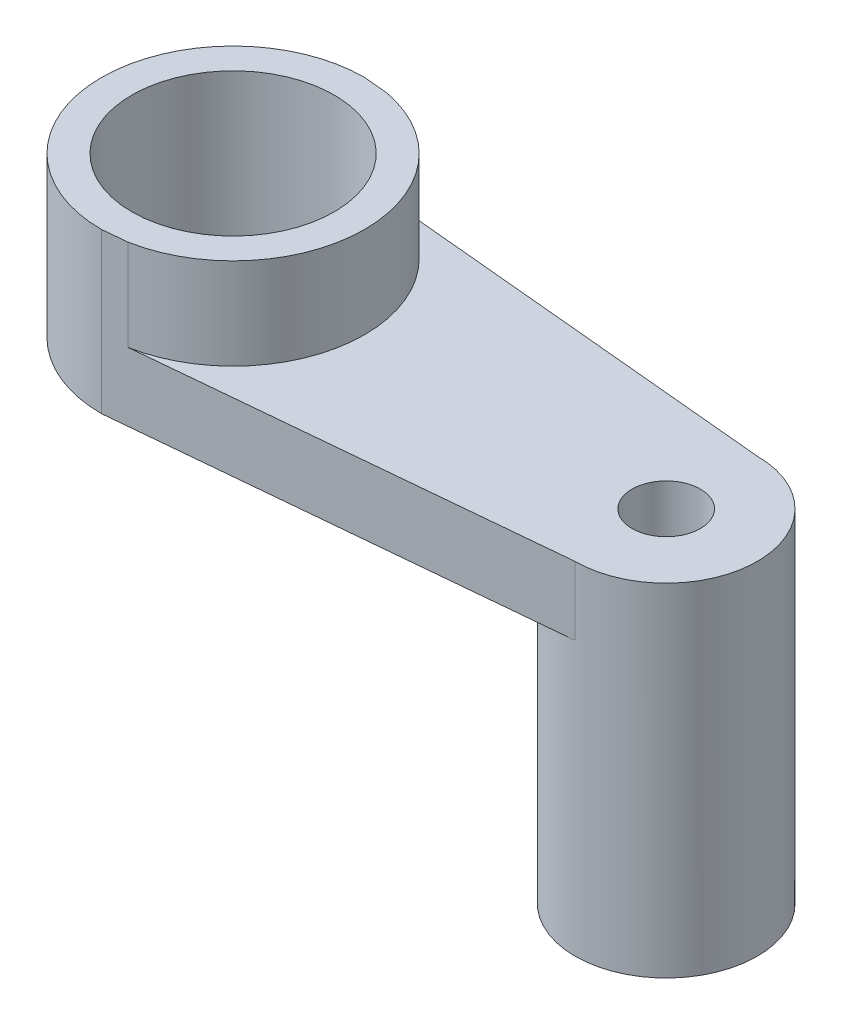
ISO-10303-21;
HEADER;
FILE_DESCRIPTION(('STEP AP214'),'2;1');
FILE_NAME('part.step','',(''),(''),'','','');
FILE_SCHEMA(('AUTOMOTIVE_DESIGN { 1 0 10303 214 1 1 1 1 }'));
ENDSEC;
DATA;
#1=APPLICATION_CONTEXT('core data for automotive mechanical design processes');
#2=APPLICATION_PROTOCOL_DEFINITION('international standard','automotive_design',2000,#1);
#3=PRODUCT_CONTEXT('',#1,'mechanical');
#4=PRODUCT('Part','Part','',(#3));
#5=PRODUCT_RELATED_PRODUCT_CATEGORY('part','',(#4));
#6=PRODUCT_DEFINITION_FORMATION('','',#4);
#7=PRODUCT_DEFINITION_CONTEXT('part definition',#1,'design');
#8=PRODUCT_DEFINITION('design','',#6,#7);
#9=PRODUCT_DEFINITION_SHAPE('','',#8);
#10=(LENGTH_UNIT() NAMED_UNIT(*) SI_UNIT(.MILLI.,.METRE.));
#11=(NAMED_UNIT(*) PLANE_ANGLE_UNIT() SI_UNIT($,.RADIAN.));
#12=(NAMED_UNIT(*) SI_UNIT($,.STERADIAN.) SOLID_ANGLE_UNIT());
#13=UNCERTAINTY_MEASURE_WITH_UNIT(LENGTH_MEASURE(1.E-05),#10,'distance_accuracy_value','');
#14=(GEOMETRIC_REPRESENTATION_CONTEXT(3) GLOBAL_UNCERTAINTY_ASSIGNED_CONTEXT((#13)) GLOBAL_UNIT_ASSIGNED_CONTEXT((#10,
#11,#12)) REPRESENTATION_CONTEXT('',''));
#15=CARTESIAN_POINT('',(0.,0.,0.));
#16=DIRECTION('',(0.,0.,1.));
#17=DIRECTION('',(1.,0.,0.));
#18=AXIS2_PLACEMENT_3D('',#15,#16,#17);
#19=CARTESIAN_POINT('',(-0.0537551480765791,14.,-0.575036498164508));
#20=DIRECTION('',(-0.0930754832480089,0.,-0.995659055308668));
#21=DIRECTION('',(-0.995659055308668,0.,0.0930754832480089));
#22=AXIS2_PLACEMENT_3D('',#19,#20,#21);
#23=PLANE('',#22);
#24=DIRECTION('',(0.995659055308668,0.,-0.0930754832480089));
#25=VECTOR('',#24,1.);
#26=CARTESIAN_POINT('',(-0.0537551480765791,0.,-0.575036498164508));
#27=LINE('',#26,#25);
#28=CARTESIAN_POINT('',(-38.9529825577755,0.,3.06131308337924));
#29=VERTEX_POINT('',#28);
#30=CARTESIAN_POINT('',(-0.952982557775477,0.,-0.490975568611034));
#31=VERTEX_POINT('',#30);
#32=EDGE_CURVE('E119',#29,#31,#27,.T.);
#33=ORIENTED_EDGE('',*,*,#32,.T.);
#34=DIRECTION('',(0.,-1.,0.));
#35=VECTOR('',#34,1.);
#36=CARTESIAN_POINT('',(-0.952982557775477,6.,-0.490975568611034));
#37=LINE('',#36,#35);
#38=CARTESIAN_POINT('',(-0.952982557775477,6.,-0.490975568611034));
#39=VERTEX_POINT('',#38);
#40=EDGE_CURVE('E108',#39,#31,#37,.T.);
#41=ORIENTED_EDGE('',*,*,#40,.F.);
#42=DIRECTION('',(0.995659055308668,0.,-0.0930754832480089));
#43=VECTOR('',#42,1.);
#44=CARTESIAN_POINT('',(-0.0537551480765791,6.,-0.575036498164508));
#45=LINE('',#44,#43);
#46=CARTESIAN_POINT('',(-36.8132102990584,6.,2.86128443305071));
#47=VERTEX_POINT('',#46);
#48=EDGE_CURVE('E131',#47,#39,#45,.T.);
#49=ORIENTED_EDGE('',*,*,#48,.F.);
#50=DIRECTION('',(0.,-1.,0.));
#51=VECTOR('',#50,1.);
#52=CARTESIAN_POINT('',(-36.8132102990584,14.,2.86128443305071));
#53=LINE('',#52,#51);
#54=CARTESIAN_POINT('',(-36.8132102990584,14.,2.86128443305071));
#55=VERTEX_POINT('',#54);
#56=EDGE_CURVE('E51',#55,#47,#53,.T.);
#57=ORIENTED_EDGE('',*,*,#56,.F.);
#58=DIRECTION('',(0.995659055308668,0.,-0.0930754832480089));
#59=VECTOR('',#58,1.);
#60=CARTESIAN_POINT('',(-0.0537551480765791,14.,-0.575036498164508));
#61=LINE('',#60,#59);
#62=CARTESIAN_POINT('',(-38.9529825577755,14.,3.06131308337924));
#63=VERTEX_POINT('',#62);
#64=EDGE_CURVE('E139',#63,#55,#61,.T.);
#65=ORIENTED_EDGE('',*,*,#64,.F.);
#66=DIRECTION('',(0.,-1.,0.));
#67=VECTOR('',#66,1.);
#68=CARTESIAN_POINT('',(-38.9529825577755,14.,3.06131308337924));
#69=LINE('',#68,#67);
#70=EDGE_CURVE('E155',#63,#29,#69,.T.);
#71=ORIENTED_EDGE('',*,*,#70,.T.);
#72=EDGE_LOOP('',(#33,#41,#49,#57,#65,#71));
#73=FACE_BOUND('',#72,.T.);
#74=ADVANCED_FACE('F47',(#73),#23,.F.);
#75=CARTESIAN_POINT('',(-38.9529825577755,14.,-8.48362503558914));
#76=DIRECTION('',(0.,-1.,0.));
#77=DIRECTION('',(0.,0.,-1.));
#78=AXIS2_PLACEMENT_3D('',#75,#76,#77);
#79=CYLINDRICAL_SURFACE('',#78,11.5449381189684);
#80=ORIENTED_EDGE('',*,*,#56,.T.);
#81=CARTESIAN_POINT('',(-38.9529825577755,6.,-8.48362503558914));
#82=DIRECTION('',(0.,1.,0.));
#83=DIRECTION('',(0.,0.,1.));
#84=AXIS2_PLACEMENT_3D('',#81,#82,#83);
#85=CIRCLE('',#84,11.5449381189684);
#86=CARTESIAN_POINT('',(-36.8132102990585,6.,-19.828534504229));
#87=VERTEX_POINT('',#86);
#88=EDGE_CURVE('E68',#47,#87,#85,.T.);
#89=ORIENTED_EDGE('',*,*,#88,.T.);
#90=DIRECTION('',(0.,-1.,0.));
#91=VECTOR('',#90,1.);
#92=CARTESIAN_POINT('',(-36.8132102990585,14.,-19.828534504229));
#93=LINE('',#92,#91);
#94=CARTESIAN_POINT('',(-36.8132102990585,14.,-19.828534504229));
#95=VERTEX_POINT('',#94);
#96=EDGE_CURVE('E161',#95,#87,#93,.T.);
#97=ORIENTED_EDGE('',*,*,#96,.F.);
#98=CARTESIAN_POINT('',(-38.9529825577755,14.,-8.48362503558914));
#99=DIRECTION('',(0.,1.,0.));
#100=DIRECTION('',(0.,0.,1.));
#101=AXIS2_PLACEMENT_3D('',#98,#99,#100);
#102=CIRCLE('',#101,11.5449381189684);
#103=EDGE_CURVE('E143',#55,#95,#102,.T.);
#104=ORIENTED_EDGE('',*,*,#103,.F.);
#105=EDGE_LOOP('',(#80,#89,#97,#104));
#106=FACE_BOUND('',#105,.T.);
#107=ADVANCED_FACE('F186',(#106),#79,.T.);
#108=CARTESIAN_POINT('',(1.51862447989956,14.,-16.2452255122485));
#109=DIRECTION('',(0.0930754832480089,0.,-0.995659055308668));
#110=DIRECTION('',(-0.995659055308668,0.,-0.0930754832480089));
#111=AXIS2_PLACEMENT_3D('',#108,#109,#110);
#112=PLANE('',#111);
#113=DIRECTION('',(0.995659055308668,0.,0.0930754832480089));
#114=VECTOR('',#113,1.);
#115=CARTESIAN_POINT('',(1.51862447989956,0.,-16.2452255122485));
#116=LINE('',#115,#114);
#117=CARTESIAN_POINT('',(-38.9529825577755,0.,-20.0285631545575));
#118=VERTEX_POINT('',#117);
#119=CARTESIAN_POINT('',(-0.952982557775427,0.,-16.4762745025672));
#120=VERTEX_POINT('',#119);
#121=EDGE_CURVE('E114',#118,#120,#116,.T.);
#122=ORIENTED_EDGE('',*,*,#121,.F.);
#123=DIRECTION('',(0.,-1.,0.));
#124=VECTOR('',#123,1.);
#125=CARTESIAN_POINT('',(-38.9529825577755,14.,-20.0285631545575));
#126=LINE('',#125,#124);
#127=CARTESIAN_POINT('',(-38.9529825577755,14.,-20.0285631545575));
#128=VERTEX_POINT('',#127);
#129=EDGE_CURVE('E159',#128,#118,#126,.T.);
#130=ORIENTED_EDGE('',*,*,#129,.F.);
#131=DIRECTION('',(0.995659055308668,0.,0.0930754832480089));
#132=VECTOR('',#131,1.);
#133=CARTESIAN_POINT('',(1.51862447989956,14.,-16.2452255122485));
#134=LINE('',#133,#132);
#135=EDGE_CURVE('E146',#128,#95,#134,.T.);
#136=ORIENTED_EDGE('',*,*,#135,.T.);
#137=ORIENTED_EDGE('',*,*,#96,.T.);
#138=DIRECTION('',(0.995659055308668,0.,0.0930754832480089));
#139=VECTOR('',#138,1.);
#140=CARTESIAN_POINT('',(1.51862447989956,6.,-16.2452255122485));
#141=LINE('',#140,#139);
#142=CARTESIAN_POINT('',(-0.952982557775477,6.,-16.4762745025673));
#143=VERTEX_POINT('',#142);
#144=EDGE_CURVE('E123',#87,#143,#141,.T.);
#145=ORIENTED_EDGE('',*,*,#144,.T.);
#146=DIRECTION('',(0.,-1.,0.));
#147=VECTOR('',#146,1.);
#148=CARTESIAN_POINT('',(-0.952982557775477,6.,-16.4762745025673));
#149=LINE('',#148,#147);
#150=EDGE_CURVE('E105',#143,#120,#149,.T.);
#151=ORIENTED_EDGE('',*,*,#150,.T.);
#152=EDGE_LOOP('',(#122,#130,#136,#137,#145,#151));
#153=FACE_BOUND('',#152,.T.);
#154=ADVANCED_FACE('F121',(#153),#112,.T.);
#155=CARTESIAN_POINT('',(-38.9529825577755,14.,-8.48362503558914));
#156=DIRECTION('',(0.,-1.,0.));
#157=DIRECTION('',(0.,0.,-1.));
#158=AXIS2_PLACEMENT_3D('',#155,#156,#157);
#159=CYLINDRICAL_SURFACE('',#158,8.88072162997568);
#160=CARTESIAN_POINT('',(-38.9529825577755,14.,-8.48362503558914));
#161=DIRECTION('',(0.,1.,0.));
#162=DIRECTION('',(0.,0.,1.));
#163=AXIS2_PLACEMENT_3D('',#160,#161,#162);
#164=CIRCLE('',#163,8.88072162997568);
#165=CARTESIAN_POINT('',(-38.9529825577755,14.,0.397096594386536));
#166=VERTEX_POINT('',#165);
#167=EDGE_CURVE('E135',#166,#166,#164,.T.);
#168=ORIENTED_EDGE('',*,*,#167,.T.);
#169=EDGE_LOOP('',(#168));
#170=FACE_BOUND('',#169,.T.);
#171=CARTESIAN_POINT('',(-38.9529825577755,0.,-8.48362503558914));
#172=DIRECTION('',(0.,1.,0.));
#173=DIRECTION('',(0.,0.,1.));
#174=AXIS2_PLACEMENT_3D('',#171,#172,#173);
#175=CIRCLE('',#174,8.88072162997568);
#176=CARTESIAN_POINT('',(-38.9529825577755,0.,0.397096594386536));
#177=VERTEX_POINT('',#176);
#178=EDGE_CURVE('E125',#177,#177,#175,.T.);
#179=ORIENTED_EDGE('',*,*,#178,.F.);
#180=EDGE_LOOP('',(#179));
#181=FACE_BOUND('',#180,.T.);
#182=ADVANCED_FACE('F49',(#170,#181),#159,.F.);
#183=CARTESIAN_POINT('',(-38.9529825577755,0.,-8.48362503558914));
#184=DIRECTION('',(0.,1.,0.));
#185=DIRECTION('',(0.,0.,1.));
#186=AXIS2_PLACEMENT_3D('',#183,#184,#185);
#187=CIRCLE('',#186,11.5449381189684);
#188=EDGE_CURVE('E116',#118,#29,#187,.T.);
#189=ORIENTED_EDGE('',*,*,#188,.T.);
#190=ORIENTED_EDGE('',*,*,#70,.F.);
#191=EDGE_CURVE('E147',#128,#63,#102,.T.);
#192=ORIENTED_EDGE('',*,*,#191,.F.);
#193=ORIENTED_EDGE('',*,*,#129,.T.);
#194=EDGE_LOOP('',(#189,#190,#192,#193));
#195=FACE_BOUND('',#194,.T.);
#196=ADVANCED_FACE('F182',(#195),#79,.T.);
#197=CARTESIAN_POINT('',(0.,14.,0.));
#198=DIRECTION('',(0.,1.,0.));
#199=DIRECTION('',(0.,0.,1.));
#200=AXIS2_PLACEMENT_3D('',#197,#198,#199);
#201=PLANE('',#200);
#202=ORIENTED_EDGE('',*,*,#167,.F.);
#203=EDGE_LOOP('',(#202));
#204=FACE_BOUND('',#203,.T.);
#205=ORIENTED_EDGE('',*,*,#64,.T.);
#206=ORIENTED_EDGE('',*,*,#103,.T.);
#207=ORIENTED_EDGE('',*,*,#135,.F.);
#208=ORIENTED_EDGE('',*,*,#191,.T.);
#209=EDGE_LOOP('',(#205,#206,#207,#208));
#210=FACE_BOUND('',#209,.T.);
#211=ADVANCED_FACE('F185',(#204,#210),#201,.T.);
#212=CARTESIAN_POINT('',(0.,0.,0.));
#213=DIRECTION('',(0.,1.,0.));
#214=DIRECTION('',(0.,0.,1.));
#215=AXIS2_PLACEMENT_3D('',#212,#213,#214);
#216=PLANE('',#215);
#217=ORIENTED_EDGE('',*,*,#178,.T.);
#218=EDGE_LOOP('',(#217));
#219=FACE_BOUND('',#218,.T.);
#220=ORIENTED_EDGE('',*,*,#121,.T.);
#221=CARTESIAN_POINT('',(-0.952982557775477,0.,-8.48362503558914));
#222=DIRECTION('',(0.,1.,0.));
#223=DIRECTION('',(0.,0.,1.));
#224=AXIS2_PLACEMENT_3D('',#221,#222,#223);
#225=CIRCLE('',#224,7.99264946697811);
#226=EDGE_CURVE('E11',#120,#31,#225,.T.);
#227=ORIENTED_EDGE('',*,*,#226,.T.);
#228=ORIENTED_EDGE('',*,*,#32,.F.);
#229=ORIENTED_EDGE('',*,*,#188,.F.);
#230=EDGE_LOOP('',(#220,#227,#228,#229));
#231=FACE_BOUND('',#230,.T.);
#232=ADVANCED_FACE('F115',(#219,#231),#216,.F.);
#233=CARTESIAN_POINT('',(-0.952982557775477,6.,-8.48362503558914));
#234=DIRECTION('',(0.,-1.,0.));
#235=DIRECTION('',(0.,0.,-1.));
#236=AXIS2_PLACEMENT_3D('',#233,#234,#235);
#237=CYLINDRICAL_SURFACE('',#236,7.99264946697811);
#238=ORIENTED_EDGE('',*,*,#40,.T.);
#239=ORIENTED_EDGE('',*,*,#226,.F.);
#240=ORIENTED_EDGE('',*,*,#150,.F.);
#241=CARTESIAN_POINT('',(-0.952982557775477,6.,-8.48362503558914));
#242=DIRECTION('',(0.,1.,0.));
#243=DIRECTION('',(0.,0.,1.));
#244=AXIS2_PLACEMENT_3D('',#241,#242,#243);
#245=CIRCLE('',#244,7.99264946697811);
#246=EDGE_CURVE('E167',#39,#143,#245,.T.);
#247=ORIENTED_EDGE('',*,*,#246,.F.);
#248=EDGE_LOOP('',(#238,#239,#240,#247));
#249=FACE_BOUND('',#248,.T.);
#250=CARTESIAN_POINT('',(-0.952982557775477,-24.,-8.48362503558914));
#251=DIRECTION('',(0.,1.,0.));
#252=DIRECTION('',(0.,0.,1.));
#253=AXIS2_PLACEMENT_3D('',#250,#251,#252);
#254=CIRCLE('',#253,7.99264946697811);
#255=CARTESIAN_POINT('',(-0.952982557775477,-24.,-0.490975568611034));
#256=VERTEX_POINT('',#255);
#257=EDGE_CURVE('E233',#256,#256,#254,.T.);
#258=ORIENTED_EDGE('',*,*,#257,.T.);
#259=EDGE_LOOP('',(#258));
#260=FACE_BOUND('',#259,.T.);
#261=ADVANCED_FACE('F101',(#249,#260),#237,.T.);
#262=CARTESIAN_POINT('',(-0.952982557775477,6.,-8.48362503558914));
#263=DIRECTION('',(0.,-1.,0.));
#264=DIRECTION('',(0.,0.,-1.));
#265=AXIS2_PLACEMENT_3D('',#262,#263,#264);
#266=CYLINDRICAL_SURFACE('',#265,3.);
#267=CARTESIAN_POINT('',(-0.952982557775477,6.,-8.48362503558914));
#268=DIRECTION('',(0.,1.,0.));
#269=DIRECTION('',(0.,0.,1.));
#270=AXIS2_PLACEMENT_3D('',#267,#268,#269);
#271=CIRCLE('',#270,3.);
#272=CARTESIAN_POINT('',(-0.952982557775477,6.,-5.48362503558914));
#273=VERTEX_POINT('',#272);
#274=EDGE_CURVE('E173',#273,#273,#271,.T.);
#275=ORIENTED_EDGE('',*,*,#274,.T.);
#276=EDGE_LOOP('',(#275));
#277=FACE_BOUND('',#276,.T.);
#278=CARTESIAN_POINT('',(-0.952982557775477,-24.,-8.48362503558914));
#279=DIRECTION('',(0.,1.,0.));
#280=DIRECTION('',(0.,0.,1.));
#281=AXIS2_PLACEMENT_3D('',#278,#279,#280);
#282=CIRCLE('',#281,3.);
#283=CARTESIAN_POINT('',(-0.952982557775477,-24.,-5.48362503558914));
#284=VERTEX_POINT('',#283);
#285=EDGE_CURVE('E230',#284,#284,#282,.T.);
#286=ORIENTED_EDGE('',*,*,#285,.F.);
#287=EDGE_LOOP('',(#286));
#288=FACE_BOUND('',#287,.T.);
#289=ADVANCED_FACE('F213',(#277,#288),#266,.F.);
#290=CARTESIAN_POINT('',(0.,6.,0.));
#291=DIRECTION('',(0.,1.,0.));
#292=DIRECTION('',(0.,0.,1.));
#293=AXIS2_PLACEMENT_3D('',#290,#291,#292);
#294=PLANE('',#293);
#295=ORIENTED_EDGE('',*,*,#274,.F.);
#296=EDGE_LOOP('',(#295));
#297=FACE_BOUND('',#296,.T.);
#298=ORIENTED_EDGE('',*,*,#246,.T.);
#299=ORIENTED_EDGE('',*,*,#144,.F.);
#300=ORIENTED_EDGE('',*,*,#88,.F.);
#301=ORIENTED_EDGE('',*,*,#48,.T.);
#302=EDGE_LOOP('',(#298,#299,#300,#301));
#303=FACE_BOUND('',#302,.T.);
#304=ADVANCED_FACE('F166',(#297,#303),#294,.T.);
#305=CARTESIAN_POINT('',(0.,-24.,0.));
#306=DIRECTION('',(0.,1.,0.));
#307=DIRECTION('',(0.,0.,1.));
#308=AXIS2_PLACEMENT_3D('',#305,#306,#307);
#309=PLANE('',#308);
#310=ORIENTED_EDGE('',*,*,#285,.T.);
#311=EDGE_LOOP('',(#310));
#312=FACE_BOUND('',#311,.T.);
#313=ORIENTED_EDGE('',*,*,#257,.F.);
#314=EDGE_LOOP('',(#313));
#315=FACE_BOUND('',#314,.T.);
#316=ADVANCED_FACE('F221',(#312,#315),#309,.F.);
#317=CLOSED_SHELL('',(#74,#107,#154,#182,#196,#211,#232,#261,#289,#304,#316));
#318=MANIFOLD_SOLID_BREP('B2',#317);
#319=ADVANCED_BREP_SHAPE_REPRESENTATION('',(#18,#318),#14);
#320=SHAPE_DEFINITION_REPRESENTATION(#9,#319);
ENDSEC;
END-ISO-10303-21;
